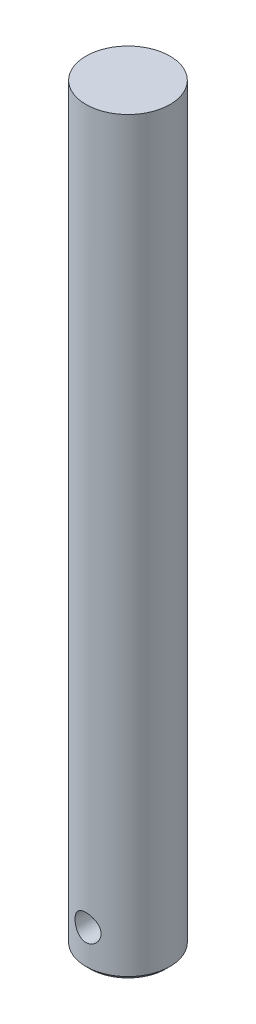
ISO-10303-21;
HEADER;
FILE_DESCRIPTION(('STEP AP214'),'2;1');
FILE_NAME('part.step','',(''),(''),'','','');
FILE_SCHEMA(('AUTOMOTIVE_DESIGN { 1 0 10303 214 1 1 1 1 }'));
ENDSEC;
DATA;
#1=APPLICATION_CONTEXT('core data for automotive mechanical design processes');
#2=APPLICATION_PROTOCOL_DEFINITION('international standard','automotive_design',2000,#1);
#3=PRODUCT_CONTEXT('',#1,'mechanical');
#4=PRODUCT('Part','Part','',(#3));
#5=PRODUCT_RELATED_PRODUCT_CATEGORY('part','',(#4));
#6=PRODUCT_DEFINITION_FORMATION('','',#4);
#7=PRODUCT_DEFINITION_CONTEXT('part definition',#1,'design');
#8=PRODUCT_DEFINITION('design','',#6,#7);
#9=PRODUCT_DEFINITION_SHAPE('','',#8);
#10=(LENGTH_UNIT() NAMED_UNIT(*) SI_UNIT(.MILLI.,.METRE.));
#11=(NAMED_UNIT(*) PLANE_ANGLE_UNIT() SI_UNIT($,.RADIAN.));
#12=(NAMED_UNIT(*) SI_UNIT($,.STERADIAN.) SOLID_ANGLE_UNIT());
#13=UNCERTAINTY_MEASURE_WITH_UNIT(LENGTH_MEASURE(1.E-05),#10,'distance_accuracy_value','');
#14=(GEOMETRIC_REPRESENTATION_CONTEXT(3) GLOBAL_UNCERTAINTY_ASSIGNED_CONTEXT((#13)) GLOBAL_UNIT_ASSIGNED_CONTEXT((#10,
#11,#12)) REPRESENTATION_CONTEXT('',''));
#15=CARTESIAN_POINT('',(0.,0.,0.));
#16=DIRECTION('',(0.,0.,1.));
#17=DIRECTION('',(1.,0.,0.));
#18=AXIS2_PLACEMENT_3D('',#15,#16,#17);
#19=CARTESIAN_POINT('',(0.,178.8,0.));
#20=DIRECTION('',(0.,-1.,0.));
#21=DIRECTION('',(0.,0.,-1.));
#22=AXIS2_PLACEMENT_3D('',#19,#20,#21);
#23=CYLINDRICAL_SURFACE('',#22,10.);
#24=CARTESIAN_POINT('',(-3.1,9.05,9.50736556570744));
#25=CARTESIAN_POINT('',(-3.09999864890097,9.2195755485155,9.50736676636621));
#26=CARTESIAN_POINT('',(-3.08603861369875,9.38916463612306,9.51195208830856));
#27=CARTESIAN_POINT('',(-3.03072383584299,9.72336543512552,9.52971845612583));
#28=CARTESIAN_POINT('',(-2.98936134012092,9.88797572406575,9.54290193468916));
#29=CARTESIAN_POINT('',(-2.88079656231542,10.2073303319844,9.57623105585536));
#30=CARTESIAN_POINT('',(-2.81363944322435,10.3620913467477,9.59636452373633));
#31=CARTESIAN_POINT('',(-2.65554200648056,10.6581919058248,9.64130826344982));
#32=CARTESIAN_POINT('',(-2.56459761498185,10.7995291455042,9.66611933617294));
#33=CARTESIAN_POINT('',(-2.3582152784556,11.0695475830175,9.71856332456026));
#34=CARTESIAN_POINT('',(-2.24211213476881,11.1977082032028,9.74625941519737));
#35=CARTESIAN_POINT('',(-1.99013186884193,11.4330876093761,9.80081480803843));
#36=CARTESIAN_POINT('',(-1.8542520355008,11.5403035194169,9.82767399490095));
#37=CARTESIAN_POINT('',(-1.56284223211642,11.733039785545,9.87825089481637));
#38=CARTESIAN_POINT('',(-1.40694271192249,11.8180251078559,9.90188553940508));
#39=CARTESIAN_POINT('',(-1.0822061189548,11.9603671035671,9.94261339925288));
#40=CARTESIAN_POINT('',(-0.913372046418458,12.0177301617416,9.95970812599949));
#41=CARTESIAN_POINT('',(-0.573008728898467,12.1014642612707,9.98498290620197));
#42=CARTESIAN_POINT('',(-0.401717622303919,12.1287248195575,9.99341827405358));
#43=CARTESIAN_POINT('',(-0.0567990203013525,12.1542972970943,10.0013250976492));
#44=CARTESIAN_POINT('',(0.116827943516296,12.1526156952096,10.0007985595665));
#45=CARTESIAN_POINT('',(0.455233184487514,12.1209391637201,9.99101922016058));
#46=CARTESIAN_POINT('',(0.620111658831166,12.0919083057492,9.98206355851277));
#47=CARTESIAN_POINT('',(0.942529368401119,12.0079377773553,9.95679681576947));
#48=CARTESIAN_POINT('',(1.10006812686915,11.9529964264625,9.9404852575976));
#49=CARTESIAN_POINT('',(1.40557246813736,11.8181383296853,9.90193821347155));
#50=CARTESIAN_POINT('',(1.55339883589298,11.737926870332,9.87963330635494));
#51=CARTESIAN_POINT('',(1.8337950617162,11.555041212339,9.83145285138935));
#52=CARTESIAN_POINT('',(1.96636109647696,11.4523614031151,9.80557641228811));
#53=CARTESIAN_POINT('',(2.21822324356431,11.2224938397847,9.75175679512367));
#54=CARTESIAN_POINT('',(2.33675143365647,11.0944731906507,9.72377238141297));
#55=CARTESIAN_POINT('',(2.55088299282151,10.8201080070286,9.66980979728555));
#56=CARTESIAN_POINT('',(2.64648375048882,10.6737613881224,9.64383185563169));
#57=CARTESIAN_POINT('',(2.81292114020214,10.3647589111867,9.59661771882306));
#58=CARTESIAN_POINT('',(2.88347788248684,10.2019433532947,9.57543601886212));
#59=CARTESIAN_POINT('',(2.99593384704186,9.86592801749131,9.54085330949264));
#60=CARTESIAN_POINT('',(3.03784317134583,9.69273192356045,9.52744955757275));
#61=CARTESIAN_POINT('',(3.09034251748383,9.34821937062925,9.51054773693131));
#62=CARTESIAN_POINT('',(3.1021067271008,9.1770999352212,9.50667852853345));
#63=CARTESIAN_POINT('',(3.0972746970036,8.83532174942535,9.50825428642433));
#64=CARTESIAN_POINT('',(3.08068275429718,8.66466293316169,9.51369784148448));
#65=CARTESIAN_POINT('',(3.0206580353127,8.33367334384585,9.53291978853358));
#66=CARTESIAN_POINT('',(2.9779984230715,8.173186959384,9.54645785779539));
#67=CARTESIAN_POINT('',(2.86795478334852,7.86166628746343,9.5800899524026));
#68=CARTESIAN_POINT('',(2.80056676609347,7.71063352989381,9.60018503562314));
#69=CARTESIAN_POINT('',(2.64080106837511,7.41757610566432,9.64537341241102));
#70=CARTESIAN_POINT('',(2.54776992017527,7.27592751986389,9.67059210343362));
#71=CARTESIAN_POINT('',(2.34012430484113,7.0098241856496,9.72292459768053));
#72=CARTESIAN_POINT('',(2.22550431998355,6.88537384693096,9.75003888426889));
#73=CARTESIAN_POINT('',(1.97238630338187,6.65197773281414,9.80444240119515));
#74=CARTESIAN_POINT('',(1.83310650986774,6.54386877764929,9.83169386622826));
#75=CARTESIAN_POINT('',(1.53772505697807,6.35252722619524,9.88219703725533));
#76=CARTESIAN_POINT('',(1.3816241837213,6.26929346807041,9.90544893003414));
#77=CARTESIAN_POINT('',(1.05800912996467,6.13086520306104,9.94519819292712));
#78=CARTESIAN_POINT('',(0.890588809191828,6.07546609853243,9.96174467138602));
#79=CARTESIAN_POINT('',(0.548205229960644,5.99379002310792,9.98643498855168));
#80=CARTESIAN_POINT('',(0.3732443077696,5.9675040986533,9.99458141058493));
#81=CARTESIAN_POINT('',(0.0284551538653172,5.94551853281406,10.0013853824155));
#82=CARTESIAN_POINT('',(-0.141289457313185,5.94860919002347,10.0004182354368));
#83=CARTESIAN_POINT('',(-0.477732405013067,5.98237047166902,9.98999976757164));
#84=CARTESIAN_POINT('',(-0.644430934099947,6.01303934648349,9.98054898490547));
#85=CARTESIAN_POINT('',(-0.968064964317699,6.1003204544212,9.95434153847421));
#86=CARTESIAN_POINT('',(-1.12509440878579,6.1566132705812,9.93767494532364));
#87=CARTESIAN_POINT('',(-1.42755666362608,6.29325642057971,9.89875549252942));
#88=CARTESIAN_POINT('',(-1.57298749523682,6.37361084833755,9.87650168236303));
#89=CARTESIAN_POINT('',(-1.85343048190948,6.559214811522,9.82780452302839));
#90=CARTESIAN_POINT('',(-1.98792960743177,6.66520892343317,9.80124569242192));
#91=CARTESIAN_POINT('',(-2.23763443627727,6.89776468039006,9.74727365130231));
#92=CARTESIAN_POINT('',(-2.35283439053035,7.02433243211541,9.71986018907547));
#93=CARTESIAN_POINT('',(-2.56443933819458,7.29936656031645,9.666228451726));
#94=CARTESIAN_POINT('',(-2.66011316854785,7.44841025055532,9.64007782242423));
#95=CARTESIAN_POINT('',(-2.82494766900962,7.76124242928736,9.59307344394776));
#96=CARTESIAN_POINT('',(-2.89411948015454,7.92502468608039,9.57221747022905));
#97=CARTESIAN_POINT('',(-2.99869526124161,8.24754512351158,9.5399451366621));
#98=CARTESIAN_POINT('',(-3.03657438236825,8.40541482648134,9.52784912196117));
#99=CARTESIAN_POINT('',(-3.08722442937452,8.72551958261552,9.51155969647856));
#100=CARTESIAN_POINT('',(-3.10000129270383,8.88775359428268,9.50736441694175));
#101=CARTESIAN_POINT('',(-3.1,9.05,9.50736556570744));
#102=B_SPLINE_CURVE_WITH_KNOTS('',3,(#24,#25,#26,#27,#28,#29,#30,#31,#32,#33,#34,#35,#36,#37,
#38,#39,#40,#41,#42,#43,#44,#45,#46,#47,#48,#49,#50,#51,#52,#53,#54,#55,#56,#57,#58,#59,#60,#61,
#62,#63,#64,#65,#66,#67,#68,#69,#70,#71,#72,#73,#74,#75,#76,#77,#78,#79,#80,#81,#82,#83,#84,#85,
#86,#87,#88,#89,#90,#91,#92,#93,#94,#95,#96,#97,#98,#99,#100,#101),.UNSPECIFIED.,.T.,.F.,(4,2,2,
2,2,2,2,2,2,2,2,2,2,2,2,2,2,2,2,2,2,2,2,2,2,2,2,2,2,2,2,2,2,2,2,2,2,2,4),(0.,0.508127484507294,
1.01639879663348,1.52378421957181,2.0312565951042,2.55428048966281,3.07737615095994,
3.61209545309212,4.14669109762865,4.66502779874302,5.18324846878219,5.68385921453387,
6.18450243272816,6.69121518852718,7.19805462054028,7.72569570997921,8.25339686855992,
8.78682249617941,9.32005992298398,9.83218754771354,10.3442375730134,10.8417914192469,
11.3394255779988,11.8511482041754,12.3630017954766,12.8956805147702,13.4283343505677,
13.9570134573076,14.4855299272299,14.9923800021415,15.4991979236582,15.9998641271726,
16.50061556408,17.0181618911841,17.5358621181428,18.0703609437859,18.6046348272529,
19.090915813556,19.5770817657183),.UNSPECIFIED.);
#103=CARTESIAN_POINT('',(-3.1,9.05,9.50736556570744));
#104=VERTEX_POINT('',#103);
#105=EDGE_CURVE('E68',#104,#104,#102,.T.);
#106=ORIENTED_EDGE('',*,*,#105,.T.);
#107=EDGE_LOOP('',(#106));
#108=FACE_BOUND('',#107,.T.);
#109=CARTESIAN_POINT('',(0.,12.15,-10.));
#110=CARTESIAN_POINT('',(-0.16979692085589,12.1499986914706,-9.99999902073557));
#111=CARTESIAN_POINT('',(-0.339607336684758,12.1360034913031,-9.99563442375018));
#112=CARTESIAN_POINT('',(-0.674266441555783,12.0805363776787,-9.97865054414503));
#113=CARTESIAN_POINT('',(-0.83911392557272,12.0390578464894,-9.96602927340371));
#114=CARTESIAN_POINT('',(-1.15897272927845,11.9301541759854,-9.93391167397765));
#115=CARTESIAN_POINT('',(-1.31399870780976,11.8627688192329,-9.91442589027061));
#116=CARTESIAN_POINT('',(-1.61055112364306,11.7041323402715,-9.87059390489131));
#117=CARTESIAN_POINT('',(-1.75207549506966,11.6128775737812,-9.84624696117201));
#118=CARTESIAN_POINT('',(-2.02191665750164,11.406167491526,-9.79445053429251));
#119=CARTESIAN_POINT('',(-2.14976462458015,11.2901169636409,-9.76693426248667));
#120=CARTESIAN_POINT('',(-2.38453104148637,11.0383771909521,-9.7122896138575));
#121=CARTESIAN_POINT('',(-2.49144567277949,10.9026843709556,-9.68516130863978));
#122=CARTESIAN_POINT('',(-2.68383734587671,10.6114718361095,-9.63364954531737));
#123=CARTESIAN_POINT('',(-2.76873144192815,10.4555510095918,-9.609348635187));
#124=CARTESIAN_POINT('',(-2.91089923867893,10.1307706394713,-9.56724635351237));
#125=CARTESIAN_POINT('',(-2.96818008364983,9.96191445570116,-9.54944330109188));
#126=CARTESIAN_POINT('',(-3.05178495406997,9.62134176640289,-9.52305054549581));
#127=CARTESIAN_POINT('',(-3.07897757392956,9.44985902020522,-9.51420299743532));
#128=CARTESIAN_POINT('',(-3.10434744264988,9.10455461072518,-9.50595714202736));
#129=CARTESIAN_POINT('',(-3.10253226471091,8.93073356975264,-9.50655636836613));
#130=CARTESIAN_POINT('',(-3.07061800700967,8.5928468385409,-9.51690857154057));
#131=CARTESIAN_POINT('',(-3.04161982654159,8.42866441662932,-9.52630523759645));
#132=CARTESIAN_POINT('',(-2.95794639851261,8.10762041974494,-9.55261520285249));
#133=CARTESIAN_POINT('',(-2.90326846169922,7.95075961340311,-9.56952928928697));
#134=CARTESIAN_POINT('',(-2.76900342399107,7.64617475691648,-9.60924366073289));
#135=CARTESIAN_POINT('',(-2.68906833995311,7.4986151710353,-9.63212534527812));
#136=CARTESIAN_POINT('',(-2.5067997800713,7.21864119591289,-9.68115905879403));
#137=CARTESIAN_POINT('',(-2.4044605640586,7.08623070128656,-9.70731192513766));
#138=CARTESIAN_POINT('',(-2.17487334538022,6.83408557837457,-9.76137382843075));
#139=CARTESIAN_POINT('',(-2.0467155374126,6.71518347652579,-9.78930907837817));
#140=CARTESIAN_POINT('',(-1.77193162064485,6.50035812132048,-9.84275484470535));
#141=CARTESIAN_POINT('',(-1.62530418798238,6.40443651658743,-9.86826518704281));
#142=CARTESIAN_POINT('',(-1.31615737091425,6.23774290514777,-9.91424741310582));
#143=CARTESIAN_POINT('',(-1.15352615362243,6.16716664787066,-9.93467972030203));
#144=CARTESIAN_POINT('',(-0.817919686324556,6.05461922592694,-9.96791813365005));
#145=CARTESIAN_POINT('',(-0.644947541952469,6.01263951949253,-9.98072651691769));
#146=CARTESIAN_POINT('',(-0.300638148558493,5.95988849209149,-9.99690877528752));
#147=CARTESIAN_POINT('',(-0.129489365513027,5.94798987708245,-10.0006232685849));
#148=CARTESIAN_POINT('',(0.212376219031705,5.95256419831394,-9.99920497500667));
#149=CARTESIAN_POINT('',(0.383093079000959,5.96903306311329,-9.99407345775425));
#150=CARTESIAN_POINT('',(0.714919594666442,6.0289685084504,-9.97576338237303));
#151=CARTESIAN_POINT('',(0.876162017891077,6.07176676321792,-9.96278416046779));
#152=CARTESIAN_POINT('',(1.18913446446706,6.18233292609421,-9.93029379265401));
#153=CARTESIAN_POINT('',(1.34086331610715,6.25010390285429,-9.9107818440301));
#154=CARTESIAN_POINT('',(1.63457371739727,6.41052200103882,-9.86664943350378));
#155=CARTESIAN_POINT('',(1.77623162648863,6.50373004140788,-9.84191704144451));
#156=CARTESIAN_POINT('',(2.04227505065869,6.71170173156808,-9.79017420669188));
#157=CARTESIAN_POINT('',(2.16665593689705,6.82647113875534,-9.76316315660666));
#158=CARTESIAN_POINT('',(2.39964211637346,7.07960889753618,-9.70858418694528));
#159=CARTESIAN_POINT('',(2.50744420520636,7.21872233782862,-9.68103555865981));
#160=CARTESIAN_POINT('',(2.69824263692462,7.51366359552413,-9.6296046302432));
#161=CARTESIAN_POINT('',(2.78123943084053,7.66949110894799,-9.60572226345288));
#162=CARTESIAN_POINT('',(2.91954365006883,7.99307727580349,-9.56459521120936));
#163=CARTESIAN_POINT('',(2.97496313967633,8.16078442483711,-9.54732372869111));
#164=CARTESIAN_POINT('',(3.05658418408721,8.50379337253187,-9.52151044789343));
#165=CARTESIAN_POINT('',(3.08279662892951,8.67909231519873,-9.51296539600616));
#166=CARTESIAN_POINT('',(3.10448580741133,9.02392291369421,-9.50590778775765));
#167=CARTESIAN_POINT('',(3.10127847417601,9.19336404302381,-9.50696567365777));
#168=CARTESIAN_POINT('',(3.06738863255875,9.52916798548705,-9.51795340966393));
#169=CARTESIAN_POINT('',(3.03670736788091,9.69553093761725,-9.52788285816744));
#170=CARTESIAN_POINT('',(2.94961523274471,10.0181440632459,-9.55519716100731));
#171=CARTESIAN_POINT('',(2.89357520590321,10.1745041501887,-9.57247435099066));
#172=CARTESIAN_POINT('',(2.75764759447982,10.4757273816266,-9.61251146789651));
#173=CARTESIAN_POINT('',(2.67775521507416,10.6205882071099,-9.63527249700809));
#174=CARTESIAN_POINT('',(2.49278489522552,10.900750024278,-9.68480840625829));
#175=CARTESIAN_POINT('',(2.38685418432441,11.0354665574816,-9.71170426580515));
#176=CARTESIAN_POINT('',(2.15432170013904,11.285637752021,-9.76591677924899));
#177=CARTESIAN_POINT('',(2.02771443242891,11.4010872769607,-9.79323354324163));
#178=CARTESIAN_POINT('',(1.75255504376496,11.6131361549884,-9.84625677988313));
#179=CARTESIAN_POINT('',(1.60343105987636,11.7090154584932,-9.87188392696448));
#180=CARTESIAN_POINT('',(1.29038694828326,11.8742151000046,-9.9176541524624));
#181=CARTESIAN_POINT('',(1.12647289842432,11.9435462868562,-9.93779947004383));
#182=CARTESIAN_POINT('',(0.803593103212457,12.0484053449689,-9.9688595003439));
#183=CARTESIAN_POINT('',(0.645488020512695,12.0863949268131,-9.98043679382465));
#184=CARTESIAN_POINT('',(0.324925507538768,12.1371904272928,-9.99600677336269));
#185=CARTESIAN_POINT('',(0.162468931415851,12.1500012520567,-10.0000009370019));
#186=CARTESIAN_POINT('',(0.,12.15,-10.));
#187=B_SPLINE_CURVE_WITH_KNOTS('',3,(#109,#110,#111,#112,#113,#114,#115,#116,#117,#118,#119,
#120,#121,#122,#123,#124,#125,#126,#127,#128,#129,#130,#131,#132,#133,#134,#135,#136,#137,#138,
#139,#140,#141,#142,#143,#144,#145,#146,#147,#148,#149,#150,#151,#152,#153,#154,#155,#156,#157,
#158,#159,#160,#161,#162,#163,#164,#165,#166,#167,#168,#169,#170,#171,#172,#173,#174,#175,#176,
#177,#178,#179,#180,#181,#182,#183,#184,#185,#186),.UNSPECIFIED.,.T.,.F.,(4,2,2,2,2,2,2,2,2,2,2,
2,2,2,2,2,2,2,2,2,2,2,2,2,2,2,2,2,2,2,2,2,2,2,2,2,2,2,4),(0.,0.508793660386022,1.01770987813483,
1.52584770479442,2.03406315713354,2.55622032523606,3.07847265358456,3.61339375403707,
4.14817638200768,4.66708171587239,5.18585157892855,5.68447946031444,6.18315957098777,
6.68903412267705,7.19503843662965,7.72368894251595,8.25237736250055,8.78506537400786,
9.31759420216291,9.82984902968713,10.3420303419877,10.8417185459025,11.3414681720557,
11.853279479043,12.3652276465346,12.8971171300694,13.4289969417581,13.958697364449,
14.4882002186917,14.9941383098298,15.500053499059,15.9987980699051,16.497642966466,
17.0157339453742,17.5339628223974,18.06874783616,18.6033140770697,19.0902444272055,
19.5770798886344),.UNSPECIFIED.);
#188=CARTESIAN_POINT('',(0.,12.15,-10.));
#189=VERTEX_POINT('',#188);
#190=EDGE_CURVE('E10',#189,#189,#187,.T.);
#191=ORIENTED_EDGE('',*,*,#190,.T.);
#192=EDGE_LOOP('',(#191));
#193=FACE_BOUND('',#192,.T.);
#194=CARTESIAN_POINT('',(0.,1.00000000000008,0.));
#195=DIRECTION('',(0.,1.,0.));
#196=DIRECTION('',(0.,0.,1.));
#197=AXIS2_PLACEMENT_3D('',#194,#195,#196);
#198=CIRCLE('',#197,10.);
#199=CARTESIAN_POINT('',(0.,1.00000000000008,10.));
#200=VERTEX_POINT('',#199);
#201=EDGE_CURVE('E62',#200,#200,#198,.T.);
#202=ORIENTED_EDGE('',*,*,#201,.T.);
#203=EDGE_LOOP('',(#202));
#204=FACE_BOUND('',#203,.T.);
#205=CARTESIAN_POINT('',(0.,178.8,0.));
#206=DIRECTION('',(0.,1.,0.));
#207=DIRECTION('',(0.,0.,1.));
#208=AXIS2_PLACEMENT_3D('',#205,#206,#207);
#209=CIRCLE('',#208,10.);
#210=CARTESIAN_POINT('',(0.,178.8,10.));
#211=VERTEX_POINT('',#210);
#212=EDGE_CURVE('E108',#211,#211,#209,.T.);
#213=ORIENTED_EDGE('',*,*,#212,.F.);
#214=EDGE_LOOP('',(#213));
#215=FACE_BOUND('',#214,.T.);
#216=ADVANCED_FACE('F43',(#108,#193,#204,#215),#23,.T.);
#217=CARTESIAN_POINT('',(0.,178.8,0.));
#218=DIRECTION('',(0.,1.,0.));
#219=DIRECTION('',(0.,0.,1.));
#220=AXIS2_PLACEMENT_3D('',#217,#218,#219);
#221=PLANE('',#220);
#222=ORIENTED_EDGE('',*,*,#212,.T.);
#223=EDGE_LOOP('',(#222));
#224=FACE_BOUND('',#223,.T.);
#225=ADVANCED_FACE('F81',(#224),#221,.T.);
#226=CARTESIAN_POINT('',(0.,0.,0.));
#227=DIRECTION('',(0.,1.,0.));
#228=DIRECTION('',(0.,0.,1.));
#229=AXIS2_PLACEMENT_3D('',#226,#227,#228);
#230=PLANE('',#229);
#231=CARTESIAN_POINT('',(0.,0.,0.));
#232=DIRECTION('',(0.,-1.,0.));
#233=DIRECTION('',(0.,0.,-1.));
#234=AXIS2_PLACEMENT_3D('',#231,#232,#233);
#235=CIRCLE('',#234,2.5);
#236=CARTESIAN_POINT('',(0.,0.,-2.5));
#237=VERTEX_POINT('',#236);
#238=EDGE_CURVE('E111',#237,#237,#235,.T.);
#239=ORIENTED_EDGE('',*,*,#238,.F.);
#240=EDGE_LOOP('',(#239));
#241=FACE_BOUND('',#240,.T.);
#242=CARTESIAN_POINT('',(0.,0.,0.));
#243=DIRECTION('',(0.,1.,0.));
#244=DIRECTION('',(0.,0.,1.));
#245=AXIS2_PLACEMENT_3D('',#242,#243,#244);
#246=CIRCLE('',#245,8.99999999999991);
#247=CARTESIAN_POINT('',(0.,0.,8.99999999999991));
#248=VERTEX_POINT('',#247);
#249=EDGE_CURVE('E57',#248,#248,#246,.F.);
#250=ORIENTED_EDGE('',*,*,#249,.T.);
#251=EDGE_LOOP('',(#250));
#252=FACE_BOUND('',#251,.T.);
#253=ADVANCED_FACE('F85',(#241,#252),#230,.F.);
#254=CARTESIAN_POINT('',(0.,1.00000000000008,0.));
#255=DIRECTION('',(0.,1.,0.));
#256=DIRECTION('',(0.,0.,1.));
#257=AXIS2_PLACEMENT_3D('',#254,#255,#256);
#258=CONICAL_SURFACE('',#257,10.,0.785398163397452);
#259=ORIENTED_EDGE('',*,*,#249,.F.);
#260=EDGE_LOOP('',(#259));
#261=FACE_BOUND('',#260,.T.);
#262=ORIENTED_EDGE('',*,*,#201,.F.);
#263=EDGE_LOOP('',(#262));
#264=FACE_BOUND('',#263,.T.);
#265=ADVANCED_FACE('F46',(#261,#264),#258,.T.);
#266=CARTESIAN_POINT('',(0.,9.05,145.));
#267=DIRECTION('',(0.,0.,-1.));
#268=DIRECTION('',(-1.,0.,0.));
#269=AXIS2_PLACEMENT_3D('',#266,#267,#268);
#270=CYLINDRICAL_SURFACE('',#269,3.1);
#271=CARTESIAN_POINT('',(0.,5.95,-2.5));
#272=CARTESIAN_POINT('',(0.119778360676658,5.95000998664619,-2.49998971851635));
#273=CARTESIAN_POINT('',(0.239689539985005,5.95701100229955,-2.49132259950738));
#274=CARTESIAN_POINT('',(0.475617759933917,5.98439048179517,-2.45724645227951));
#275=CARTESIAN_POINT('',(0.591627698312462,6.00479208787324,-2.43180846121194));
#276=CARTESIAN_POINT('',(0.815730353912269,6.0570505980773,-2.36603936515137));
#277=CARTESIAN_POINT('',(0.923867467554761,6.08883611215779,-2.32580103358272));
#278=CARTESIAN_POINT('',(1.13099059708294,6.16158626706959,-2.23243967306767));
#279=CARTESIAN_POINT('',(1.22997546362095,6.20255205856303,-2.17931502887333));
#280=CARTESIAN_POINT('',(1.45090450952974,6.30690107860095,-2.04139671257541));
#281=CARTESIAN_POINT('',(1.56866360440175,6.37309912512295,-1.95203816131875));
#282=CARTESIAN_POINT('',(1.7850404255772,6.51224178920737,-1.75642105479194));
#283=CARTESIAN_POINT('',(1.88360171240231,6.58520539557124,-1.65011429129574));
#284=CARTESIAN_POINT('',(2.017286965089,6.69543472341988,-1.47848368052726));
#285=CARTESIAN_POINT('',(2.05977934340619,6.73261850914577,-1.41870007446406));
#286=CARTESIAN_POINT('',(2.13959589417189,6.80610451909022,-1.29519889513243));
#287=CARTESIAN_POINT('',(2.17691840410622,6.84240645664567,-1.23148006586429));
#288=CARTESIAN_POINT('',(2.24609423898418,6.91283127393802,-1.10024873498607));
#289=CARTESIAN_POINT('',(2.27796204037355,6.94695976561082,-1.03274692644946));
#290=CARTESIAN_POINT('',(2.33599958602124,7.01162041518789,-0.893741618943614));
#291=CARTESIAN_POINT('',(2.36217422314001,7.04215565079087,-0.822241623101688));
#292=CARTESIAN_POINT('',(2.41154065035239,7.10162501371484,-0.664956630162179));
#293=CARTESIAN_POINT('',(2.43381803587642,7.12975244743174,-0.578564255558565));
#294=CARTESIAN_POINT('',(2.46922213667887,7.17548840551982,-0.401332279013882));
#295=CARTESIAN_POINT('',(2.48237156536743,7.19312302377622,-0.310504322122387));
#296=CARTESIAN_POINT('',(2.49859247783835,7.21499430686516,-0.125382611256911));
#297=CARTESIAN_POINT('',(2.50156886697938,7.21910453640892,-0.0310644411234237));
#298=CARTESIAN_POINT('',(2.49684928962182,7.21267846914112,0.156825944025606));
#299=CARTESIAN_POINT('',(2.48914547818581,7.20213140608139,0.250397559881687));
#300=CARTESIAN_POINT('',(2.46199489218825,7.16608453263494,0.447022341950624));
#301=CARTESIAN_POINT('',(2.44100955585001,7.13864107183959,0.549487059695922));
#302=CARTESIAN_POINT('',(2.38777531233997,7.07254978425905,0.747755030090249));
#303=CARTESIAN_POINT('',(2.35549233272118,7.03386812491526,0.843537068508586));
#304=CARTESIAN_POINT('',(2.29012853184197,6.96023512842702,1.00546278977322));
#305=CARTESIAN_POINT('',(2.25916672321896,6.92667868522294,1.07313333295221));
#306=CARTESIAN_POINT('',(2.19190662653042,6.85731088307582,1.20457297739354));
#307=CARTESIAN_POINT('',(2.15560574960943,6.82149843506423,1.26834016459819));
#308=CARTESIAN_POINT('',(2.03893319943357,6.71247133902689,1.45401664591901));
#309=CARTESIAN_POINT('',(1.95081223232775,6.63769167519204,1.57025070756858));
#310=CARTESIAN_POINT('',(1.75160111169681,6.48916505113089,1.79012948722995));
#311=CARTESIAN_POINT('',(1.63989136012433,6.41551947439527,1.89328097039918));
#312=CARTESIAN_POINT('',(1.39570626530501,6.27845170605164,2.0797717240555));
#313=CARTESIAN_POINT('',(1.26328668498952,6.21500296283939,2.16316272708942));
#314=CARTESIAN_POINT('',(1.01979463227477,6.12050475893994,2.28538194470123));
#315=CARTESIAN_POINT('',(0.913281538338357,6.08536753738163,2.33014295899967));
#316=CARTESIAN_POINT('',(0.692299383436471,6.02613432356391,2.40505608152619));
#317=CARTESIAN_POINT('',(0.577836308895638,6.00203012493935,2.43521904874611));
#318=CARTESIAN_POINT('',(0.343140845714914,5.9667545481686,2.47922918050984));
#319=CARTESIAN_POINT('',(0.222879825409665,5.95565609408665,2.49298435310289));
#320=CARTESIAN_POINT('',(-0.0188325356493619,5.9477025001006,2.50285038306527));
#321=CARTESIAN_POINT('',(-0.140283562999884,5.95084370554002,2.49896576774505));
#322=CARTESIAN_POINT('',(-0.369592159693099,5.97014888507458,2.47497973113724));
#323=CARTESIAN_POINT('',(-0.477707829230704,5.98514672394508,2.45633025016811));
#324=CARTESIAN_POINT('',(-0.688719557586179,6.02556373161853,2.4057112095014));
#325=CARTESIAN_POINT('',(-0.79161417560272,6.05098575969326,2.37373799517109));
#326=CARTESIAN_POINT('',(-0.995582572846007,6.11218342415584,2.29594741604705));
#327=CARTESIAN_POINT('',(-1.09625730275886,6.14844442647387,2.24947515235124));
#328=CARTESIAN_POINT('',(-1.28828745868955,6.22844922440337,2.14528835497946));
#329=CARTESIAN_POINT('',(-1.37964204920942,6.27219368992587,2.08757281475406));
#330=CARTESIAN_POINT('',(-1.5685751007912,6.37360158343674,1.95079494403796));
#331=CARTESIAN_POINT('',(-1.66413998612004,6.4323396411977,1.8697588935147));
#332=CARTESIAN_POINT('',(-1.84124673515975,6.55373193235877,1.69566732695565));
#333=CARTESIAN_POINT('',(-1.92275170041105,6.61639589915063,1.602581273822));
#334=CARTESIAN_POINT('',(-2.04230195013021,6.71707850244394,1.4438381148799));
#335=CARTESIAN_POINT('',(-2.08491031132651,6.7551905370954,1.38161803512879));
#336=CARTESIAN_POINT('',(-2.16464553801061,6.83024690555286,1.25301193659696));
#337=CARTESIAN_POINT('',(-2.20176964856831,6.86719064520983,1.18662384777933));
#338=CARTESIAN_POINT('',(-2.27018074659444,6.93843400031158,1.04981522138374));
#339=CARTESIAN_POINT('',(-2.30148371250482,6.97274069742773,0.979406436913327));
#340=CARTESIAN_POINT('',(-2.35794450749181,7.03706020323464,0.834354482568969));
#341=CARTESIAN_POINT('',(-2.38310913908663,7.06707774974557,0.759716114056858));
#342=CARTESIAN_POINT('',(-2.42856624200181,7.12296197970574,0.599631082950317));
#343=CARTESIAN_POINT('',(-2.44826102065036,7.14825719849879,0.513805338582111));
#344=CARTESIAN_POINT('',(-2.47860518959247,7.18796952832376,0.338244845811713));
#345=CARTESIAN_POINT('',(-2.48927872987158,7.20241567084676,0.248521214316402));
#346=CARTESIAN_POINT('',(-2.50078489626993,7.21801026933534,0.0665425174807986));
#347=CARTESIAN_POINT('',(-2.50154366013723,7.21905891650256,-0.0257264217824091));
#348=CARTESIAN_POINT('',(-2.49294583035613,7.20737677946846,-0.208953762463088));
#349=CARTESIAN_POINT('',(-2.48357655612898,7.1946287213939,-0.299910376175299));
#350=CARTESIAN_POINT('',(-2.45259921802398,7.15381359846723,-0.496668023973737));
#351=CARTESIAN_POINT('',(-2.42882492610552,7.12308061234856,-0.601548985578951));
#352=CARTESIAN_POINT('',(-2.36954227385472,7.05063971300645,-0.804037219578778));
#353=CARTESIAN_POINT('',(-2.33399864225652,7.00889888812996,-0.901621533936954));
#354=CARTESIAN_POINT('',(-2.26278696499333,6.93059832361977,-1.06566816026055));
#355=CARTESIAN_POINT('',(-2.22939184189949,6.89536996140165,-1.13379178769448));
#356=CARTESIAN_POINT('',(-2.15707029651434,6.82296940440067,-1.26598943428423));
#357=CARTESIAN_POINT('',(-2.11814134024739,6.78579632407521,-1.33006157871391));
#358=CARTESIAN_POINT('',(-2.03489715163424,6.71069726394368,-1.45422850709897));
#359=CARTESIAN_POINT('',(-1.99057778625371,6.672770725311,-1.51432018385362));
#360=CARTESIAN_POINT('',(-1.89666309949984,6.59718183060682,-1.63041482952403));
#361=CARTESIAN_POINT('',(-1.84706507852288,6.55951962031454,-1.68641568138758));
#362=CARTESIAN_POINT('',(-1.68802975013425,6.44661121322597,-1.85042085625658));
#363=CARTESIAN_POINT('',(-1.57010426927428,6.37310663197422,-1.95179033148008));
#364=CARTESIAN_POINT('',(-1.37755009978861,6.2719370544785,-2.08770591630405));
#365=CARTESIAN_POINT('',(-1.31079924420425,6.23974505108187,-2.13030055754025));
#366=CARTESIAN_POINT('',(-1.17224885881742,6.17919236086394,-2.20956950065134));
#367=CARTESIAN_POINT('',(-1.10045209639154,6.15082959848532,-2.24624701189749));
#368=CARTESIAN_POINT('',(-0.92378563551607,6.08884971875755,-2.32577915400606));
#369=CARTESIAN_POINT('',(-0.816770664538924,6.05737306984185,-2.36562957251416));
#370=CARTESIAN_POINT('',(-0.595924322883662,6.00571603578612,-2.43064951921011));
#371=CARTESIAN_POINT('',(-0.482109400389077,5.98550952410079,-2.45585300780156));
#372=CARTESIAN_POINT('',(-0.306066119073134,5.96454379840036,-2.48194766864623));
#373=CARTESIAN_POINT('',(-0.24519550022995,5.95910561601673,-2.48870157597164));
#374=CARTESIAN_POINT('',(-0.122895005603076,5.95183069217413,-2.4977309545124));
#375=CARTESIAN_POINT('',(-0.0614649903089381,5.9499948752921,-2.50000527600553));
#376=CARTESIAN_POINT('',(0.,5.95,-2.5));
#377=B_SPLINE_CURVE_WITH_KNOTS('',3,(#271,#272,#273,#274,#275,#276,#277,#278,#279,#280,#281,
#282,#283,#284,#285,#286,#287,#288,#289,#290,#291,#292,#293,#294,#295,#296,#297,#298,#299,#300,
#301,#302,#303,#304,#305,#306,#307,#308,#309,#310,#311,#312,#313,#314,#315,#316,#317,#318,#319,
#320,#321,#322,#323,#324,#325,#326,#327,#328,#329,#330,#331,#332,#333,#334,#335,#336,#337,#338,
#339,#340,#341,#342,#343,#344,#345,#346,#347,#348,#349,#350,#351,#352,#353,#354,#355,#356,#357,
#358,#359,#360,#361,#362,#363,#364,#365,#366,#367,#368,#369,#370,#371,#372,#373,#374,#375,#376),
.UNSPECIFIED.,.T.,.F.,(4,2,2,2,2,2,2,2,2,2,2,2,2,2,2,2,2,2,2,2,2,2,2,2,2,2,2,2,2,2,2,2,2,2,2,2,
2,2,2,2,2,2,2,2,2,2,2,2,2,2,2,2,4),(0.,0.359070623022655,0.718762981506723,1.07623806013682,
1.43375797001857,1.91714127370146,2.40192490534894,2.64841768811481,2.89498955433995,
3.14089653182535,3.38659132770227,3.66629544495804,3.94530104553679,4.22690768112856,
4.50872127512768,4.83133279215932,5.15492577621903,5.39951634126532,5.64422589899107,
6.1338217571336,6.63837846963134,7.14159929676524,7.50245315539383,7.8630381729273,
8.22563548450797,8.58813973953904,8.91885561645135,9.24966226683067,9.59834994649167,
9.94706885662277,10.3607838797144,10.7755686514586,11.028808623269,11.2821753768965,
11.5348360542378,11.7872154471329,12.0610951823722,12.3342393942177,12.6094173021897,
12.8849401398459,13.2186306545198,13.5533303889098,13.8039756020853,14.0547359591548,
14.305689810481,14.5567726267162,15.0695565026576,15.3256405009353,15.5815851323227,
15.9354380765006,16.2884672690008,16.4726792578372,16.6569385200247),.UNSPECIFIED.);
#378=CARTESIAN_POINT('',(0.,5.95,-2.5));
#379=VERTEX_POINT('',#378);
#380=EDGE_CURVE('E48',#379,#379,#377,.T.);
#381=ORIENTED_EDGE('',*,*,#380,.T.);
#382=EDGE_LOOP('',(#381));
#383=FACE_BOUND('',#382,.T.);
#384=ORIENTED_EDGE('',*,*,#105,.F.);
#385=EDGE_LOOP('',(#384));
#386=FACE_BOUND('',#385,.T.);
#387=ORIENTED_EDGE('',*,*,#190,.F.);
#388=EDGE_LOOP('',(#387));
#389=FACE_BOUND('',#388,.T.);
#390=ADVANCED_FACE('F74',(#383,#386,#389),#270,.F.);
#391=CARTESIAN_POINT('',(0.,10.,0.));
#392=DIRECTION('',(0.,-1.,0.));
#393=DIRECTION('',(0.,0.,-1.));
#394=AXIS2_PLACEMENT_3D('',#391,#392,#393);
#395=CYLINDRICAL_SURFACE('',#394,2.5);
#396=ORIENTED_EDGE('',*,*,#238,.T.);
#397=EDGE_LOOP('',(#396));
#398=FACE_BOUND('',#397,.T.);
#399=ORIENTED_EDGE('',*,*,#380,.F.);
#400=EDGE_LOOP('',(#399));
#401=FACE_BOUND('',#400,.T.);
#402=ADVANCED_FACE('F78',(#398,#401),#395,.F.);
#403=CLOSED_SHELL('',(#216,#225,#253,#265,#390,#402));
#404=MANIFOLD_SOLID_BREP('B2',#403);
#405=ADVANCED_BREP_SHAPE_REPRESENTATION('',(#18,#404),#14);
#406=SHAPE_DEFINITION_REPRESENTATION(#9,#405);
ENDSEC;
END-ISO-10303-21;
